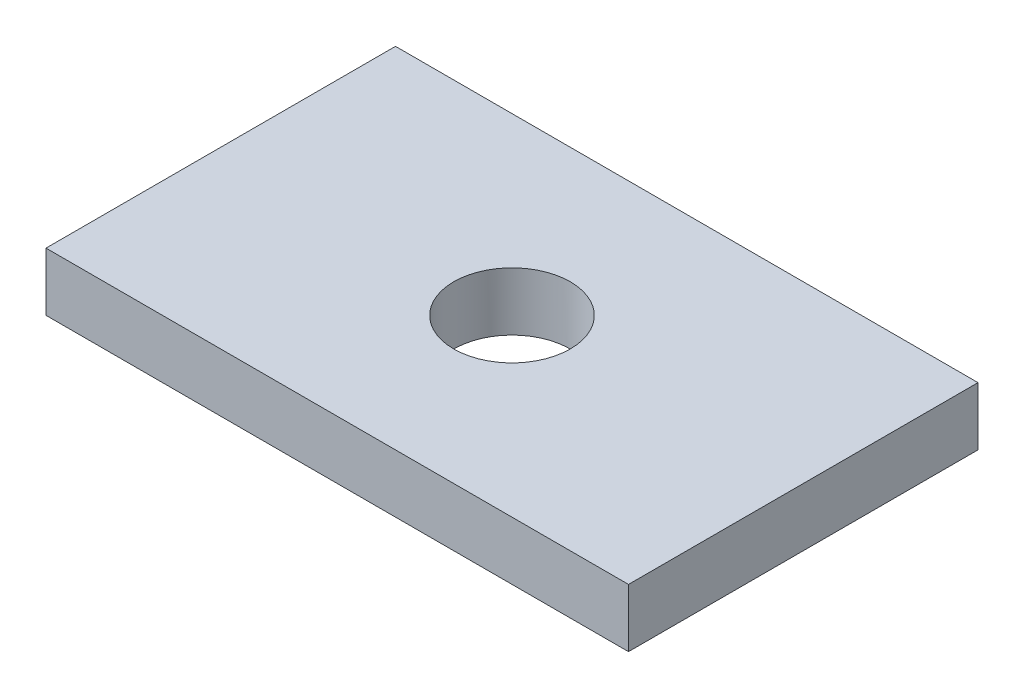
ISO-10303-21;
HEADER;
FILE_DESCRIPTION(('STEP AP214'),'2;1');
FILE_NAME('part.step','',(''),(''),'','','');
FILE_SCHEMA(('AUTOMOTIVE_DESIGN { 1 0 10303 214 1 1 1 1 }'));
ENDSEC;
DATA;
#1=APPLICATION_CONTEXT('core data for automotive mechanical design processes');
#2=APPLICATION_PROTOCOL_DEFINITION('international standard','automotive_design',2000,#1);
#3=PRODUCT_CONTEXT('',#1,'mechanical');
#4=PRODUCT('Part','Part','',(#3));
#5=PRODUCT_RELATED_PRODUCT_CATEGORY('part','',(#4));
#6=PRODUCT_DEFINITION_FORMATION('','',#4);
#7=PRODUCT_DEFINITION_CONTEXT('part definition',#1,'design');
#8=PRODUCT_DEFINITION('design','',#6,#7);
#9=PRODUCT_DEFINITION_SHAPE('','',#8);
#10=(LENGTH_UNIT() NAMED_UNIT(*) SI_UNIT(.MILLI.,.METRE.));
#11=(NAMED_UNIT(*) PLANE_ANGLE_UNIT() SI_UNIT($,.RADIAN.));
#12=(NAMED_UNIT(*) SI_UNIT($,.STERADIAN.) SOLID_ANGLE_UNIT());
#13=UNCERTAINTY_MEASURE_WITH_UNIT(LENGTH_MEASURE(1.E-05),#10,'distance_accuracy_value','');
#14=(GEOMETRIC_REPRESENTATION_CONTEXT(3) GLOBAL_UNCERTAINTY_ASSIGNED_CONTEXT((#13)) GLOBAL_UNIT_ASSIGNED_CONTEXT((#10,
#11,#12)) REPRESENTATION_CONTEXT('',''));
#15=CARTESIAN_POINT('',(0.,0.,0.));
#16=DIRECTION('',(0.,0.,1.));
#17=DIRECTION('',(1.,0.,0.));
#18=AXIS2_PLACEMENT_3D('',#15,#16,#17);
#19=CARTESIAN_POINT('',(63.5,12.7,38.1));
#20=DIRECTION('',(-1.,0.,0.));
#21=DIRECTION('',(0.,0.,1.));
#22=AXIS2_PLACEMENT_3D('',#19,#20,#21);
#23=PLANE('',#22);
#24=DIRECTION('',(0.,0.,-1.));
#25=VECTOR('',#24,1.);
#26=CARTESIAN_POINT('',(63.5,0.,38.1));
#27=LINE('',#26,#25);
#28=CARTESIAN_POINT('',(63.5,0.,38.1));
#29=VERTEX_POINT('',#28);
#30=CARTESIAN_POINT('',(63.5,0.,-38.1));
#31=VERTEX_POINT('',#30);
#32=EDGE_CURVE('E107',#29,#31,#27,.T.);
#33=ORIENTED_EDGE('',*,*,#32,.T.);
#34=DIRECTION('',(0.,-1.,0.));
#35=VECTOR('',#34,1.);
#36=CARTESIAN_POINT('',(63.5,12.7,-38.1));
#37=LINE('',#36,#35);
#38=CARTESIAN_POINT('',(63.5,12.7,-38.1));
#39=VERTEX_POINT('',#38);
#40=EDGE_CURVE('E11',#39,#31,#37,.T.);
#41=ORIENTED_EDGE('',*,*,#40,.F.);
#42=DIRECTION('',(0.,0.,-1.));
#43=VECTOR('',#42,1.);
#44=CARTESIAN_POINT('',(63.5,12.7,38.1));
#45=LINE('',#44,#43);
#46=CARTESIAN_POINT('',(63.5,12.7,38.1));
#47=VERTEX_POINT('',#46);
#48=EDGE_CURVE('E91',#47,#39,#45,.T.);
#49=ORIENTED_EDGE('',*,*,#48,.F.);
#50=DIRECTION('',(0.,-1.,0.));
#51=VECTOR('',#50,1.);
#52=CARTESIAN_POINT('',(63.5,12.7,38.1));
#53=LINE('',#52,#51);
#54=EDGE_CURVE('E103',#47,#29,#53,.T.);
#55=ORIENTED_EDGE('',*,*,#54,.T.);
#56=EDGE_LOOP('',(#33,#41,#49,#55));
#57=FACE_BOUND('',#56,.T.);
#58=ADVANCED_FACE('F39',(#57),#23,.F.);
#59=CARTESIAN_POINT('',(-63.5,12.7,-38.1));
#60=DIRECTION('',(0.,0.,1.));
#61=DIRECTION('',(1.,0.,0.));
#62=AXIS2_PLACEMENT_3D('',#59,#60,#61);
#63=PLANE('',#62);
#64=DIRECTION('',(-1.,0.,0.));
#65=VECTOR('',#64,1.);
#66=CARTESIAN_POINT('',(-63.5,0.,-38.1));
#67=LINE('',#66,#65);
#68=CARTESIAN_POINT('',(-63.5,0.,-38.1));
#69=VERTEX_POINT('',#68);
#70=EDGE_CURVE('E96',#31,#69,#67,.T.);
#71=ORIENTED_EDGE('',*,*,#70,.T.);
#72=DIRECTION('',(0.,-1.,0.));
#73=VECTOR('',#72,1.);
#74=CARTESIAN_POINT('',(-63.5,12.7,-38.1));
#75=LINE('',#74,#73);
#76=CARTESIAN_POINT('',(-63.5,12.7,-38.1));
#77=VERTEX_POINT('',#76);
#78=EDGE_CURVE('E48',#77,#69,#75,.T.);
#79=ORIENTED_EDGE('',*,*,#78,.F.);
#80=DIRECTION('',(-1.,0.,0.));
#81=VECTOR('',#80,1.);
#82=CARTESIAN_POINT('',(-63.5,12.7,-38.1));
#83=LINE('',#82,#81);
#84=EDGE_CURVE('E86',#39,#77,#83,.T.);
#85=ORIENTED_EDGE('',*,*,#84,.F.);
#86=ORIENTED_EDGE('',*,*,#40,.T.);
#87=EDGE_LOOP('',(#71,#79,#85,#86));
#88=FACE_BOUND('',#87,.T.);
#89=ADVANCED_FACE('F95',(#88),#63,.F.);
#90=CARTESIAN_POINT('',(-63.5,12.7,38.1));
#91=DIRECTION('',(1.,0.,0.));
#92=DIRECTION('',(0.,0.,-1.));
#93=AXIS2_PLACEMENT_3D('',#90,#91,#92);
#94=PLANE('',#93);
#95=DIRECTION('',(0.,0.,1.));
#96=VECTOR('',#95,1.);
#97=CARTESIAN_POINT('',(-63.5,0.,38.1));
#98=LINE('',#97,#96);
#99=CARTESIAN_POINT('',(-63.5,0.,38.1));
#100=VERTEX_POINT('',#99);
#101=EDGE_CURVE('E73',#69,#100,#98,.T.);
#102=ORIENTED_EDGE('',*,*,#101,.T.);
#103=DIRECTION('',(0.,-1.,0.));
#104=VECTOR('',#103,1.);
#105=CARTESIAN_POINT('',(-63.5,12.7,38.1));
#106=LINE('',#105,#104);
#107=CARTESIAN_POINT('',(-63.5,12.7,38.1));
#108=VERTEX_POINT('',#107);
#109=EDGE_CURVE('E98',#108,#100,#106,.T.);
#110=ORIENTED_EDGE('',*,*,#109,.F.);
#111=DIRECTION('',(0.,0.,1.));
#112=VECTOR('',#111,1.);
#113=CARTESIAN_POINT('',(-63.5,12.7,38.1));
#114=LINE('',#113,#112);
#115=EDGE_CURVE('E89',#77,#108,#114,.T.);
#116=ORIENTED_EDGE('',*,*,#115,.F.);
#117=ORIENTED_EDGE('',*,*,#78,.T.);
#118=EDGE_LOOP('',(#102,#110,#116,#117));
#119=FACE_BOUND('',#118,.T.);
#120=ADVANCED_FACE('F99',(#119),#94,.F.);
#121=CARTESIAN_POINT('',(-63.5,12.7,38.1));
#122=DIRECTION('',(0.,0.,-1.));
#123=DIRECTION('',(-1.,0.,0.));
#124=AXIS2_PLACEMENT_3D('',#121,#122,#123);
#125=PLANE('',#124);
#126=DIRECTION('',(1.,0.,0.));
#127=VECTOR('',#126,1.);
#128=CARTESIAN_POINT('',(-63.5,0.,38.1));
#129=LINE('',#128,#127);
#130=EDGE_CURVE('E79',#100,#29,#129,.T.);
#131=ORIENTED_EDGE('',*,*,#130,.T.);
#132=ORIENTED_EDGE('',*,*,#54,.F.);
#133=DIRECTION('',(1.,0.,0.));
#134=VECTOR('',#133,1.);
#135=CARTESIAN_POINT('',(-63.5,12.7,38.1));
#136=LINE('',#135,#134);
#137=EDGE_CURVE('E56',#108,#47,#136,.T.);
#138=ORIENTED_EDGE('',*,*,#137,.F.);
#139=ORIENTED_EDGE('',*,*,#109,.T.);
#140=EDGE_LOOP('',(#131,#132,#138,#139));
#141=FACE_BOUND('',#140,.T.);
#142=ADVANCED_FACE('F121',(#141),#125,.F.);
#143=CARTESIAN_POINT('',(0.,12.7,0.));
#144=DIRECTION('',(0.,-1.,0.));
#145=DIRECTION('',(0.,0.,-1.));
#146=AXIS2_PLACEMENT_3D('',#143,#144,#145);
#147=PLANE('',#146);
#148=CARTESIAN_POINT('',(0.,12.7,0.));
#149=DIRECTION('',(0.,-1.,0.));
#150=DIRECTION('',(0.,0.,-1.));
#151=AXIS2_PLACEMENT_3D('',#148,#149,#150);
#152=CIRCLE('',#151,12.7);
#153=CARTESIAN_POINT('',(0.,12.7,-12.7));
#154=VERTEX_POINT('',#153);
#155=EDGE_CURVE('E111',#154,#154,#152,.T.);
#156=ORIENTED_EDGE('',*,*,#155,.T.);
#157=EDGE_LOOP('',(#156));
#158=FACE_BOUND('',#157,.T.);
#159=ORIENTED_EDGE('',*,*,#48,.T.);
#160=ORIENTED_EDGE('',*,*,#84,.T.);
#161=ORIENTED_EDGE('',*,*,#115,.T.);
#162=ORIENTED_EDGE('',*,*,#137,.T.);
#163=EDGE_LOOP('',(#159,#160,#161,#162));
#164=FACE_BOUND('',#163,.T.);
#165=ADVANCED_FACE('F87',(#158,#164),#147,.F.);
#166=CARTESIAN_POINT('',(0.,0.,0.));
#167=DIRECTION('',(0.,-1.,0.));
#168=DIRECTION('',(0.,0.,-1.));
#169=AXIS2_PLACEMENT_3D('',#166,#167,#168);
#170=PLANE('',#169);
#171=CARTESIAN_POINT('',(0.,0.,0.));
#172=DIRECTION('',(0.,1.,0.));
#173=DIRECTION('',(0.,0.,1.));
#174=AXIS2_PLACEMENT_3D('',#171,#172,#173);
#175=CIRCLE('',#174,12.7);
#176=CARTESIAN_POINT('',(0.,0.,12.7));
#177=VERTEX_POINT('',#176);
#178=EDGE_CURVE('E131',#177,#177,#175,.T.);
#179=ORIENTED_EDGE('',*,*,#178,.T.);
#180=EDGE_LOOP('',(#179));
#181=FACE_BOUND('',#180,.T.);
#182=ORIENTED_EDGE('',*,*,#32,.F.);
#183=ORIENTED_EDGE('',*,*,#130,.F.);
#184=ORIENTED_EDGE('',*,*,#101,.F.);
#185=ORIENTED_EDGE('',*,*,#70,.F.);
#186=EDGE_LOOP('',(#182,#183,#184,#185));
#187=FACE_BOUND('',#186,.T.);
#188=ADVANCED_FACE('F124',(#181,#187),#170,.T.);
#189=CARTESIAN_POINT('',(0.,0.,0.));
#190=DIRECTION('',(0.,1.,0.));
#191=DIRECTION('',(0.,0.,1.));
#192=AXIS2_PLACEMENT_3D('',#189,#190,#191);
#193=CYLINDRICAL_SURFACE('',#192,12.7);
#194=ORIENTED_EDGE('',*,*,#178,.F.);
#195=EDGE_LOOP('',(#194));
#196=FACE_BOUND('',#195,.T.);
#197=ORIENTED_EDGE('',*,*,#155,.F.);
#198=EDGE_LOOP('',(#197));
#199=FACE_BOUND('',#198,.T.);
#200=ADVANCED_FACE('F137',(#196,#199),#193,.F.);
#201=CLOSED_SHELL('',(#58,#89,#120,#142,#165,#188,#200));
#202=MANIFOLD_SOLID_BREP('B2',#201);
#203=ADVANCED_BREP_SHAPE_REPRESENTATION('',(#18,#202),#14);
#204=SHAPE_DEFINITION_REPRESENTATION(#9,#203);
ENDSEC;
END-ISO-10303-21;
